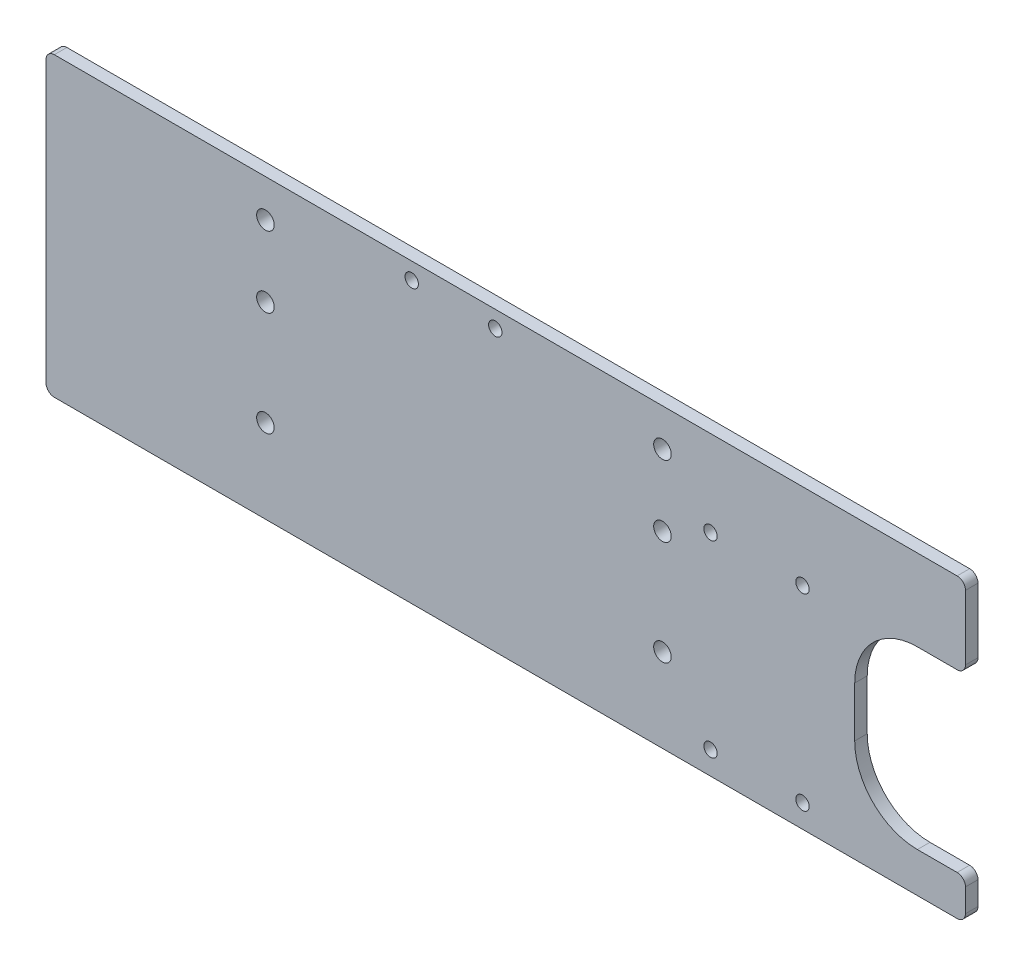
ISO-10303-21;
HEADER;
FILE_DESCRIPTION(('STEP AP214'),'2;1');
FILE_NAME('part.step','',(''),(''),'','','');
FILE_SCHEMA(('AUTOMOTIVE_DESIGN { 1 0 10303 214 1 1 1 1 }'));
ENDSEC;
DATA;
#1=APPLICATION_CONTEXT('core data for automotive mechanical design processes');
#2=APPLICATION_PROTOCOL_DEFINITION('international standard','automotive_design',2000,#1);
#3=PRODUCT_CONTEXT('',#1,'mechanical');
#4=PRODUCT('Part','Part','',(#3));
#5=PRODUCT_RELATED_PRODUCT_CATEGORY('part','',(#4));
#6=PRODUCT_DEFINITION_FORMATION('','',#4);
#7=PRODUCT_DEFINITION_CONTEXT('part definition',#1,'design');
#8=PRODUCT_DEFINITION('design','',#6,#7);
#9=PRODUCT_DEFINITION_SHAPE('','',#8);
#10=(LENGTH_UNIT() NAMED_UNIT(*) SI_UNIT(.MILLI.,.METRE.));
#11=(NAMED_UNIT(*) PLANE_ANGLE_UNIT() SI_UNIT($,.RADIAN.));
#12=(NAMED_UNIT(*) SI_UNIT($,.STERADIAN.) SOLID_ANGLE_UNIT());
#13=UNCERTAINTY_MEASURE_WITH_UNIT(LENGTH_MEASURE(1.E-05),#10,'distance_accuracy_value','');
#14=(GEOMETRIC_REPRESENTATION_CONTEXT(3) GLOBAL_UNCERTAINTY_ASSIGNED_CONTEXT((#13)) GLOBAL_UNIT_ASSIGNED_CONTEXT((#10,
#11,#12)) REPRESENTATION_CONTEXT('',''));
#15=CARTESIAN_POINT('',(0.,0.,0.));
#16=DIRECTION('',(0.,0.,1.));
#17=DIRECTION('',(1.,0.,0.));
#18=AXIS2_PLACEMENT_3D('',#15,#16,#17);
#19=CARTESIAN_POINT('',(120.,30.,-79.1580697086532));
#20=DIRECTION('',(1.,0.,0.));
#21=DIRECTION('',(0.,0.,-1.));
#22=AXIS2_PLACEMENT_3D('',#19,#20,#21);
#23=PLANE('',#22);
#24=DIRECTION('',(0.,1.,0.));
#25=VECTOR('',#24,1.);
#26=CARTESIAN_POINT('',(120.,30.,3.));
#27=LINE('',#26,#25);
#28=CARTESIAN_POINT('',(120.,-39.,3.));
#29=VERTEX_POINT('',#28);
#30=CARTESIAN_POINT('',(120.,-33.45,3.));
#31=VERTEX_POINT('',#30);
#32=EDGE_CURVE('E196',#29,#31,#27,.T.);
#33=ORIENTED_EDGE('',*,*,#32,.F.);
#34=DIRECTION('',(0.,0.,1.));
#35=VECTOR('',#34,1.);
#36=CARTESIAN_POINT('',(120.,-39.,-79.1580697086532));
#37=LINE('',#36,#35);
#38=CARTESIAN_POINT('',(120.,-39.,0.));
#39=VERTEX_POINT('',#38);
#40=EDGE_CURVE('E342',#29,#39,#37,.F.);
#41=ORIENTED_EDGE('',*,*,#40,.T.);
#42=DIRECTION('',(0.,-1.,0.));
#43=VECTOR('',#42,1.);
#44=CARTESIAN_POINT('',(120.,30.,0.));
#45=LINE('',#44,#43);
#46=CARTESIAN_POINT('',(120.,-33.45,0.));
#47=VERTEX_POINT('',#46);
#48=EDGE_CURVE('E192',#47,#39,#45,.T.);
#49=ORIENTED_EDGE('',*,*,#48,.F.);
#50=DIRECTION('',(0.,0.,-1.));
#51=VECTOR('',#50,1.);
#52=CARTESIAN_POINT('',(120.,-33.45,3.));
#53=LINE('',#52,#51);
#54=EDGE_CURVE('E340',#47,#31,#53,.F.);
#55=ORIENTED_EDGE('',*,*,#54,.T.);
#56=EDGE_LOOP('',(#33,#41,#49,#55));
#57=FACE_BOUND('',#56,.T.);
#58=ADVANCED_FACE('F36',(#57),#23,.T.);
#59=CARTESIAN_POINT('',(0.,0.,3.));
#60=DIRECTION('',(0.,0.,1.));
#61=DIRECTION('',(1.,0.,0.));
#62=AXIS2_PLACEMENT_3D('',#59,#60,#61);
#63=PLANE('',#62);
#64=CARTESIAN_POINT('',(120.,12.55,3.));
#65=VERTEX_POINT('',#64);
#66=CARTESIAN_POINT('',(120.,28.,3.));
#67=VERTEX_POINT('',#66);
#68=EDGE_CURVE('E191',#65,#67,#27,.T.);
#69=ORIENTED_EDGE('',*,*,#68,.T.);
#70=CARTESIAN_POINT('',(118.,28.,3.));
#71=DIRECTION('',(0.,0.,1.));
#72=DIRECTION('',(1.,0.,0.));
#73=AXIS2_PLACEMENT_3D('',#70,#71,#72);
#74=CIRCLE('',#73,2.);
#75=CARTESIAN_POINT('',(118.,30.,3.));
#76=VERTEX_POINT('',#75);
#77=EDGE_CURVE('E313',#67,#76,#74,.T.);
#78=ORIENTED_EDGE('',*,*,#77,.T.);
#79=DIRECTION('',(-1.,0.,0.));
#80=VECTOR('',#79,1.);
#81=CARTESIAN_POINT('',(-100.,30.,3.));
#82=LINE('',#81,#80);
#83=CARTESIAN_POINT('',(-98.,30.,3.));
#84=VERTEX_POINT('',#83);
#85=EDGE_CURVE('E209',#76,#84,#82,.T.);
#86=ORIENTED_EDGE('',*,*,#85,.T.);
#87=CARTESIAN_POINT('',(-98.,28.,3.));
#88=DIRECTION('',(0.,0.,1.));
#89=DIRECTION('',(1.,0.,0.));
#90=AXIS2_PLACEMENT_3D('',#87,#88,#89);
#91=CIRCLE('',#90,2.);
#92=CARTESIAN_POINT('',(-100.,28.,3.));
#93=VERTEX_POINT('',#92);
#94=EDGE_CURVE('E311',#84,#93,#91,.T.);
#95=ORIENTED_EDGE('',*,*,#94,.T.);
#96=DIRECTION('',(0.,-1.,0.));
#97=VECTOR('',#96,1.);
#98=CARTESIAN_POINT('',(-100.,27.,3.));
#99=LINE('',#98,#97);
#100=CARTESIAN_POINT('',(-100.,-39.,3.));
#101=VERTEX_POINT('',#100);
#102=EDGE_CURVE('E268',#93,#101,#99,.T.);
#103=ORIENTED_EDGE('',*,*,#102,.T.);
#104=CARTESIAN_POINT('',(-98.,-39.,3.));
#105=DIRECTION('',(0.,0.,1.));
#106=DIRECTION('',(1.,0.,0.));
#107=AXIS2_PLACEMENT_3D('',#104,#105,#106);
#108=CIRCLE('',#107,2.);
#109=CARTESIAN_POINT('',(-98.,-41.,3.));
#110=VERTEX_POINT('',#109);
#111=EDGE_CURVE('E309',#101,#110,#108,.T.);
#112=ORIENTED_EDGE('',*,*,#111,.T.);
#113=DIRECTION('',(1.,0.,0.));
#114=VECTOR('',#113,1.);
#115=CARTESIAN_POINT('',(-100.,-41.,3.));
#116=LINE('',#115,#114);
#117=CARTESIAN_POINT('',(118.,-41.,3.));
#118=VERTEX_POINT('',#117);
#119=EDGE_CURVE('E225',#110,#118,#116,.T.);
#120=ORIENTED_EDGE('',*,*,#119,.T.);
#121=CARTESIAN_POINT('',(118.,-39.,3.));
#122=DIRECTION('',(0.,0.,1.));
#123=DIRECTION('',(1.,0.,0.));
#124=AXIS2_PLACEMENT_3D('',#121,#122,#123);
#125=CIRCLE('',#124,2.);
#126=EDGE_CURVE('E307',#118,#29,#125,.T.);
#127=ORIENTED_EDGE('',*,*,#126,.T.);
#128=ORIENTED_EDGE('',*,*,#32,.T.);
#129=CARTESIAN_POINT('',(118.,-33.45,3.));
#130=DIRECTION('',(0.,0.,1.));
#131=DIRECTION('',(1.,0.,0.));
#132=AXIS2_PLACEMENT_3D('',#129,#130,#131);
#133=CIRCLE('',#132,2.);
#134=CARTESIAN_POINT('',(118.,-31.45,3.));
#135=VERTEX_POINT('',#134);
#136=EDGE_CURVE('E181',#31,#135,#133,.T.);
#137=ORIENTED_EDGE('',*,*,#136,.T.);
#138=DIRECTION('',(1.,0.,0.));
#139=VECTOR('',#138,1.);
#140=CARTESIAN_POINT('',(120.,-31.45,3.));
#141=LINE('',#140,#139);
#142=CARTESIAN_POINT('',(108.5,-31.45,3.));
#143=VERTEX_POINT('',#142);
#144=EDGE_CURVE('E169',#143,#135,#141,.T.);
#145=ORIENTED_EDGE('',*,*,#144,.F.);
#146=CARTESIAN_POINT('',(108.5,-16.45,3.));
#147=DIRECTION('',(0.,0.,1.));
#148=DIRECTION('',(1.,0.,0.));
#149=AXIS2_PLACEMENT_3D('',#146,#147,#148);
#150=CIRCLE('',#149,15.);
#151=CARTESIAN_POINT('',(93.5,-16.45,3.));
#152=VERTEX_POINT('',#151);
#153=EDGE_CURVE('E151',#143,#152,#150,.F.);
#154=ORIENTED_EDGE('',*,*,#153,.T.);
#155=DIRECTION('',(0.,-1.,0.));
#156=VECTOR('',#155,1.);
#157=CARTESIAN_POINT('',(93.5,10.55,3.));
#158=LINE('',#157,#156);
#159=CARTESIAN_POINT('',(93.5,-4.45,3.));
#160=VERTEX_POINT('',#159);
#161=EDGE_CURVE('E183',#160,#152,#158,.T.);
#162=ORIENTED_EDGE('',*,*,#161,.F.);
#163=CARTESIAN_POINT('',(108.5,-4.45,3.));
#164=DIRECTION('',(0.,0.,1.));
#165=DIRECTION('',(1.,0.,0.));
#166=AXIS2_PLACEMENT_3D('',#163,#164,#165);
#167=CIRCLE('',#166,15.);
#168=CARTESIAN_POINT('',(108.5,10.55,3.));
#169=VERTEX_POINT('',#168);
#170=EDGE_CURVE('E294',#160,#169,#167,.F.);
#171=ORIENTED_EDGE('',*,*,#170,.T.);
#172=DIRECTION('',(-1.,0.,0.));
#173=VECTOR('',#172,1.);
#174=CARTESIAN_POINT('',(120.,10.55,3.));
#175=LINE('',#174,#173);
#176=CARTESIAN_POINT('',(118.,10.55,3.));
#177=VERTEX_POINT('',#176);
#178=EDGE_CURVE('E186',#177,#169,#175,.T.);
#179=ORIENTED_EDGE('',*,*,#178,.F.);
#180=CARTESIAN_POINT('',(118.,12.55,3.));
#181=DIRECTION('',(0.,0.,1.));
#182=DIRECTION('',(1.,0.,0.));
#183=AXIS2_PLACEMENT_3D('',#180,#181,#182);
#184=CIRCLE('',#183,2.);
#185=EDGE_CURVE('E304',#177,#65,#184,.T.);
#186=ORIENTED_EDGE('',*,*,#185,.T.);
#187=EDGE_LOOP('',(#69,#78,#86,#95,#103,#112,#120,#127,#128,#137,#145,#154,#162,#171,#179,#186));
#188=FACE_BOUND('',#187,.T.);
#189=CARTESIAN_POINT('',(-12.5,26.,3.));
#190=DIRECTION('',(0.,0.,1.));
#191=DIRECTION('',(1.,0.,0.));
#192=AXIS2_PLACEMENT_3D('',#189,#190,#191);
#193=CIRCLE('',#192,1.6);
#194=CARTESIAN_POINT('',(-10.9,26.,3.));
#195=VERTEX_POINT('',#194);
#196=EDGE_CURVE('E198',#195,#195,#193,.T.);
#197=ORIENTED_EDGE('',*,*,#196,.F.);
#198=EDGE_LOOP('',(#197));
#199=FACE_BOUND('',#198,.T.);
#200=CARTESIAN_POINT('',(7.50000000000001,26.,3.));
#201=DIRECTION('',(0.,0.,1.));
#202=DIRECTION('',(1.,0.,0.));
#203=AXIS2_PLACEMENT_3D('',#200,#201,#202);
#204=CIRCLE('',#203,1.6);
#205=CARTESIAN_POINT('',(9.10000000000001,26.,3.));
#206=VERTEX_POINT('',#205);
#207=EDGE_CURVE('E202',#206,#206,#204,.T.);
#208=ORIENTED_EDGE('',*,*,#207,.F.);
#209=EDGE_LOOP('',(#208));
#210=FACE_BOUND('',#209,.T.);
#211=CARTESIAN_POINT('',(59.,-35.5,3.));
#212=DIRECTION('',(0.,0.,1.));
#213=DIRECTION('',(1.,0.,0.));
#214=AXIS2_PLACEMENT_3D('',#211,#212,#213);
#215=CIRCLE('',#214,1.6);
#216=CARTESIAN_POINT('',(60.6,-35.5,3.));
#217=VERTEX_POINT('',#216);
#218=EDGE_CURVE('E208',#217,#217,#215,.T.);
#219=ORIENTED_EDGE('',*,*,#218,.F.);
#220=EDGE_LOOP('',(#219));
#221=FACE_BOUND('',#220,.T.);
#222=CARTESIAN_POINT('',(81.,-35.5,3.));
#223=DIRECTION('',(0.,0.,1.));
#224=DIRECTION('',(1.,0.,0.));
#225=AXIS2_PLACEMENT_3D('',#222,#223,#224);
#226=CIRCLE('',#225,1.60000000000001);
#227=CARTESIAN_POINT('',(82.6,-35.5,3.));
#228=VERTEX_POINT('',#227);
#229=EDGE_CURVE('E217',#228,#228,#226,.T.);
#230=ORIENTED_EDGE('',*,*,#229,.F.);
#231=EDGE_LOOP('',(#230));
#232=FACE_BOUND('',#231,.T.);
#233=CARTESIAN_POINT('',(81.,9.5,3.));
#234=DIRECTION('',(0.,0.,1.));
#235=DIRECTION('',(1.,0.,0.));
#236=AXIS2_PLACEMENT_3D('',#233,#234,#235);
#237=CIRCLE('',#236,1.6);
#238=CARTESIAN_POINT('',(82.6,9.5,3.));
#239=VERTEX_POINT('',#238);
#240=EDGE_CURVE('E213',#239,#239,#237,.T.);
#241=ORIENTED_EDGE('',*,*,#240,.F.);
#242=EDGE_LOOP('',(#241));
#243=FACE_BOUND('',#242,.T.);
#244=CARTESIAN_POINT('',(59.,9.5,3.));
#245=DIRECTION('',(0.,0.,1.));
#246=DIRECTION('',(1.,0.,0.));
#247=AXIS2_PLACEMENT_3D('',#244,#245,#246);
#248=CIRCLE('',#247,1.6);
#249=CARTESIAN_POINT('',(60.6,9.5,3.));
#250=VERTEX_POINT('',#249);
#251=EDGE_CURVE('E216',#250,#250,#248,.T.);
#252=ORIENTED_EDGE('',*,*,#251,.F.);
#253=EDGE_LOOP('',(#252));
#254=FACE_BOUND('',#253,.T.);
#255=CARTESIAN_POINT('',(47.5,4.,3.));
#256=DIRECTION('',(0.,0.,1.));
#257=DIRECTION('',(-1.,0.,0.));
#258=AXIS2_PLACEMENT_3D('',#255,#256,#257);
#259=CIRCLE('',#258,2.1);
#260=CARTESIAN_POINT('',(45.4,4.,3.));
#261=VERTEX_POINT('',#260);
#262=EDGE_CURVE('E238',#261,#261,#259,.T.);
#263=ORIENTED_EDGE('',*,*,#262,.F.);
#264=EDGE_LOOP('',(#263));
#265=FACE_BOUND('',#264,.T.);
#266=CARTESIAN_POINT('',(-47.5,4.,3.));
#267=DIRECTION('',(0.,0.,1.));
#268=DIRECTION('',(1.,0.,0.));
#269=AXIS2_PLACEMENT_3D('',#266,#267,#268);
#270=CIRCLE('',#269,2.1);
#271=CARTESIAN_POINT('',(-45.4,4.,3.));
#272=VERTEX_POINT('',#271);
#273=EDGE_CURVE('E250',#272,#272,#270,.T.);
#274=ORIENTED_EDGE('',*,*,#273,.F.);
#275=EDGE_LOOP('',(#274));
#276=FACE_BOUND('',#275,.T.);
#277=CARTESIAN_POINT('',(47.5,-21.,3.));
#278=DIRECTION('',(0.,0.,1.));
#279=DIRECTION('',(-1.,0.,0.));
#280=AXIS2_PLACEMENT_3D('',#277,#278,#279);
#281=CIRCLE('',#280,2.1);
#282=CARTESIAN_POINT('',(45.4,-21.,3.));
#283=VERTEX_POINT('',#282);
#284=EDGE_CURVE('E262',#283,#283,#281,.T.);
#285=ORIENTED_EDGE('',*,*,#284,.F.);
#286=EDGE_LOOP('',(#285));
#287=FACE_BOUND('',#286,.T.);
#288=CARTESIAN_POINT('',(-47.5,21.,3.));
#289=DIRECTION('',(0.,0.,1.));
#290=DIRECTION('',(1.,0.,0.));
#291=AXIS2_PLACEMENT_3D('',#288,#289,#290);
#292=CIRCLE('',#291,2.1);
#293=CARTESIAN_POINT('',(-45.4,21.,3.));
#294=VERTEX_POINT('',#293);
#295=EDGE_CURVE('E256',#294,#294,#292,.T.);
#296=ORIENTED_EDGE('',*,*,#295,.F.);
#297=EDGE_LOOP('',(#296));
#298=FACE_BOUND('',#297,.T.);
#299=CARTESIAN_POINT('',(-47.5,-21.,3.));
#300=DIRECTION('',(0.,0.,1.));
#301=DIRECTION('',(1.,0.,0.));
#302=AXIS2_PLACEMENT_3D('',#299,#300,#301);
#303=CIRCLE('',#302,2.1);
#304=CARTESIAN_POINT('',(-45.4,-21.,3.));
#305=VERTEX_POINT('',#304);
#306=EDGE_CURVE('E244',#305,#305,#303,.T.);
#307=ORIENTED_EDGE('',*,*,#306,.F.);
#308=EDGE_LOOP('',(#307));
#309=FACE_BOUND('',#308,.T.);
#310=CARTESIAN_POINT('',(47.5,21.,3.));
#311=DIRECTION('',(0.,0.,1.));
#312=DIRECTION('',(-1.,0.,0.));
#313=AXIS2_PLACEMENT_3D('',#310,#311,#312);
#314=CIRCLE('',#313,2.1);
#315=CARTESIAN_POINT('',(45.4,21.,3.));
#316=VERTEX_POINT('',#315);
#317=EDGE_CURVE('E232',#316,#316,#314,.T.);
#318=ORIENTED_EDGE('',*,*,#317,.F.);
#319=EDGE_LOOP('',(#318));
#320=FACE_BOUND('',#319,.T.);
#321=ADVANCED_FACE('F177',(#188,#199,#210,#221,#232,#243,#254,#265,#276,#287,#298,#309,#320),
#63,.T.);
#322=CARTESIAN_POINT('',(0.,0.,0.));
#323=DIRECTION('',(0.,0.,1.));
#324=DIRECTION('',(1.,0.,0.));
#325=AXIS2_PLACEMENT_3D('',#322,#323,#324);
#326=PLANE('',#325);
#327=CARTESIAN_POINT('',(-12.5,26.,0.));
#328=DIRECTION('',(0.,0.,1.));
#329=DIRECTION('',(1.,0.,0.));
#330=AXIS2_PLACEMENT_3D('',#327,#328,#329);
#331=CIRCLE('',#330,1.6);
#332=CARTESIAN_POINT('',(-10.9,26.,0.));
#333=VERTEX_POINT('',#332);
#334=EDGE_CURVE('E212',#333,#333,#331,.T.);
#335=ORIENTED_EDGE('',*,*,#334,.T.);
#336=EDGE_LOOP('',(#335));
#337=FACE_BOUND('',#336,.T.);
#338=CARTESIAN_POINT('',(7.50000000000001,26.,0.));
#339=DIRECTION('',(0.,0.,1.));
#340=DIRECTION('',(1.,0.,0.));
#341=AXIS2_PLACEMENT_3D('',#338,#339,#340);
#342=CIRCLE('',#341,1.6);
#343=CARTESIAN_POINT('',(9.10000000000001,26.,0.));
#344=VERTEX_POINT('',#343);
#345=EDGE_CURVE('E201',#344,#344,#342,.T.);
#346=ORIENTED_EDGE('',*,*,#345,.T.);
#347=EDGE_LOOP('',(#346));
#348=FACE_BOUND('',#347,.T.);
#349=CARTESIAN_POINT('',(59.,-35.5,0.));
#350=DIRECTION('',(0.,0.,1.));
#351=DIRECTION('',(1.,0.,0.));
#352=AXIS2_PLACEMENT_3D('',#349,#350,#351);
#353=CIRCLE('',#352,1.6);
#354=CARTESIAN_POINT('',(60.6,-35.5,0.));
#355=VERTEX_POINT('',#354);
#356=EDGE_CURVE('E229',#355,#355,#353,.T.);
#357=ORIENTED_EDGE('',*,*,#356,.T.);
#358=EDGE_LOOP('',(#357));
#359=FACE_BOUND('',#358,.T.);
#360=CARTESIAN_POINT('',(81.,-35.5,0.));
#361=DIRECTION('',(0.,0.,1.));
#362=DIRECTION('',(1.,0.,0.));
#363=AXIS2_PLACEMENT_3D('',#360,#361,#362);
#364=CIRCLE('',#363,1.60000000000001);
#365=CARTESIAN_POINT('',(82.6,-35.5,0.));
#366=VERTEX_POINT('',#365);
#367=EDGE_CURVE('E277',#366,#366,#364,.T.);
#368=ORIENTED_EDGE('',*,*,#367,.T.);
#369=EDGE_LOOP('',(#368));
#370=FACE_BOUND('',#369,.T.);
#371=CARTESIAN_POINT('',(81.,9.5,0.));
#372=DIRECTION('',(0.,0.,1.));
#373=DIRECTION('',(1.,0.,0.));
#374=AXIS2_PLACEMENT_3D('',#371,#372,#373);
#375=CIRCLE('',#374,1.6);
#376=CARTESIAN_POINT('',(82.6,9.5,0.));
#377=VERTEX_POINT('',#376);
#378=EDGE_CURVE('E274',#377,#377,#375,.T.);
#379=ORIENTED_EDGE('',*,*,#378,.T.);
#380=EDGE_LOOP('',(#379));
#381=FACE_BOUND('',#380,.T.);
#382=CARTESIAN_POINT('',(59.,9.5,0.));
#383=DIRECTION('',(0.,0.,1.));
#384=DIRECTION('',(1.,0.,0.));
#385=AXIS2_PLACEMENT_3D('',#382,#383,#384);
#386=CIRCLE('',#385,1.6);
#387=CARTESIAN_POINT('',(60.6,9.5,0.));
#388=VERTEX_POINT('',#387);
#389=EDGE_CURVE('E224',#388,#388,#386,.T.);
#390=ORIENTED_EDGE('',*,*,#389,.T.);
#391=EDGE_LOOP('',(#390));
#392=FACE_BOUND('',#391,.T.);
#393=DIRECTION('',(1.,0.,0.));
#394=VECTOR('',#393,1.);
#395=CARTESIAN_POINT('',(-100.,30.,0.));
#396=LINE('',#395,#394);
#397=CARTESIAN_POINT('',(-98.,30.,0.));
#398=VERTEX_POINT('',#397);
#399=CARTESIAN_POINT('',(118.,30.,0.));
#400=VERTEX_POINT('',#399);
#401=EDGE_CURVE('E205',#398,#400,#396,.T.);
#402=ORIENTED_EDGE('',*,*,#401,.T.);
#403=CARTESIAN_POINT('',(118.,28.,0.));
#404=DIRECTION('',(0.,0.,1.));
#405=DIRECTION('',(1.,0.,0.));
#406=AXIS2_PLACEMENT_3D('',#403,#404,#405);
#407=CIRCLE('',#406,2.);
#408=CARTESIAN_POINT('',(120.,28.,0.));
#409=VERTEX_POINT('',#408);
#410=EDGE_CURVE('E329',#400,#409,#407,.F.);
#411=ORIENTED_EDGE('',*,*,#410,.T.);
#412=CARTESIAN_POINT('',(120.,12.55,0.));
#413=VERTEX_POINT('',#412);
#414=EDGE_CURVE('E195',#409,#413,#45,.T.);
#415=ORIENTED_EDGE('',*,*,#414,.T.);
#416=CARTESIAN_POINT('',(118.,12.55,0.));
#417=DIRECTION('',(0.,0.,1.));
#418=DIRECTION('',(1.,0.,0.));
#419=AXIS2_PLACEMENT_3D('',#416,#417,#418);
#420=CIRCLE('',#419,2.);
#421=CARTESIAN_POINT('',(118.,10.55,0.));
#422=VERTEX_POINT('',#421);
#423=EDGE_CURVE('E320',#413,#422,#420,.F.);
#424=ORIENTED_EDGE('',*,*,#423,.T.);
#425=DIRECTION('',(-1.,0.,0.));
#426=VECTOR('',#425,1.);
#427=CARTESIAN_POINT('',(0.,10.55,0.));
#428=LINE('',#427,#426);
#429=CARTESIAN_POINT('',(108.5,10.55,0.));
#430=VERTEX_POINT('',#429);
#431=EDGE_CURVE('E182',#422,#430,#428,.T.);
#432=ORIENTED_EDGE('',*,*,#431,.T.);
#433=CARTESIAN_POINT('',(108.5,-4.45,0.));
#434=DIRECTION('',(0.,0.,1.));
#435=DIRECTION('',(1.,0.,0.));
#436=AXIS2_PLACEMENT_3D('',#433,#434,#435);
#437=CIRCLE('',#436,15.);
#438=CARTESIAN_POINT('',(93.5,-4.45,0.));
#439=VERTEX_POINT('',#438);
#440=EDGE_CURVE('E297',#430,#439,#437,.T.);
#441=ORIENTED_EDGE('',*,*,#440,.T.);
#442=DIRECTION('',(0.,-1.,0.));
#443=VECTOR('',#442,1.);
#444=CARTESIAN_POINT('',(93.5,0.,0.));
#445=LINE('',#444,#443);
#446=CARTESIAN_POINT('',(93.5,-16.45,0.));
#447=VERTEX_POINT('',#446);
#448=EDGE_CURVE('E174',#439,#447,#445,.T.);
#449=ORIENTED_EDGE('',*,*,#448,.T.);
#450=CARTESIAN_POINT('',(108.5,-16.45,0.));
#451=DIRECTION('',(0.,0.,1.));
#452=DIRECTION('',(1.,0.,0.));
#453=AXIS2_PLACEMENT_3D('',#450,#451,#452);
#454=CIRCLE('',#453,15.);
#455=CARTESIAN_POINT('',(108.5,-31.45,0.));
#456=VERTEX_POINT('',#455);
#457=EDGE_CURVE('E161',#447,#456,#454,.T.);
#458=ORIENTED_EDGE('',*,*,#457,.T.);
#459=DIRECTION('',(1.,0.,0.));
#460=VECTOR('',#459,1.);
#461=CARTESIAN_POINT('',(0.,-31.45,0.));
#462=LINE('',#461,#460);
#463=CARTESIAN_POINT('',(118.,-31.45,0.));
#464=VERTEX_POINT('',#463);
#465=EDGE_CURVE('E172',#456,#464,#462,.T.);
#466=ORIENTED_EDGE('',*,*,#465,.T.);
#467=CARTESIAN_POINT('',(118.,-33.45,0.));
#468=DIRECTION('',(0.,0.,1.));
#469=DIRECTION('',(1.,0.,0.));
#470=AXIS2_PLACEMENT_3D('',#467,#468,#469);
#471=CIRCLE('',#470,2.);
#472=EDGE_CURVE('E322',#464,#47,#471,.F.);
#473=ORIENTED_EDGE('',*,*,#472,.T.);
#474=ORIENTED_EDGE('',*,*,#48,.T.);
#475=CARTESIAN_POINT('',(118.,-39.,0.));
#476=DIRECTION('',(0.,0.,1.));
#477=DIRECTION('',(1.,0.,0.));
#478=AXIS2_PLACEMENT_3D('',#475,#476,#477);
#479=CIRCLE('',#478,2.);
#480=CARTESIAN_POINT('',(118.,-41.,0.));
#481=VERTEX_POINT('',#480);
#482=EDGE_CURVE('E324',#39,#481,#479,.F.);
#483=ORIENTED_EDGE('',*,*,#482,.T.);
#484=DIRECTION('',(-1.,0.,0.));
#485=VECTOR('',#484,1.);
#486=CARTESIAN_POINT('',(-100.,-41.,0.));
#487=LINE('',#486,#485);
#488=CARTESIAN_POINT('',(-98.,-41.,0.));
#489=VERTEX_POINT('',#488);
#490=EDGE_CURVE('E228',#481,#489,#487,.T.);
#491=ORIENTED_EDGE('',*,*,#490,.T.);
#492=CARTESIAN_POINT('',(-98.,-39.,0.));
#493=DIRECTION('',(0.,0.,1.));
#494=DIRECTION('',(1.,0.,0.));
#495=AXIS2_PLACEMENT_3D('',#492,#493,#494);
#496=CIRCLE('',#495,2.);
#497=CARTESIAN_POINT('',(-100.,-39.,0.));
#498=VERTEX_POINT('',#497);
#499=EDGE_CURVE('E51',#489,#498,#496,.F.);
#500=ORIENTED_EDGE('',*,*,#499,.T.);
#501=DIRECTION('',(0.,-1.,0.));
#502=VECTOR('',#501,1.);
#503=CARTESIAN_POINT('',(-100.,27.,0.));
#504=LINE('',#503,#502);
#505=CARTESIAN_POINT('',(-100.,28.,0.));
#506=VERTEX_POINT('',#505);
#507=EDGE_CURVE('E265',#506,#498,#504,.T.);
#508=ORIENTED_EDGE('',*,*,#507,.F.);
#509=CARTESIAN_POINT('',(-98.,28.,0.));
#510=DIRECTION('',(0.,0.,1.));
#511=DIRECTION('',(1.,0.,0.));
#512=AXIS2_PLACEMENT_3D('',#509,#510,#511);
#513=CIRCLE('',#512,2.);
#514=EDGE_CURVE('E327',#506,#398,#513,.F.);
#515=ORIENTED_EDGE('',*,*,#514,.T.);
#516=EDGE_LOOP('',(#402,#411,#415,#424,#432,#441,#449,#458,#466,#473,#474,#483,#491,#500,#508,#515));
#517=FACE_BOUND('',#516,.T.);
#518=CARTESIAN_POINT('',(47.5,-21.,0.));
#519=DIRECTION('',(0.,0.,1.));
#520=DIRECTION('',(-1.,0.,0.));
#521=AXIS2_PLACEMENT_3D('',#518,#519,#520);
#522=CIRCLE('',#521,2.1);
#523=CARTESIAN_POINT('',(45.4,-21.,0.));
#524=VERTEX_POINT('',#523);
#525=EDGE_CURVE('E259',#524,#524,#522,.T.);
#526=ORIENTED_EDGE('',*,*,#525,.T.);
#527=EDGE_LOOP('',(#526));
#528=FACE_BOUND('',#527,.T.);
#529=CARTESIAN_POINT('',(-47.5,21.,0.));
#530=DIRECTION('',(0.,0.,1.));
#531=DIRECTION('',(1.,0.,0.));
#532=AXIS2_PLACEMENT_3D('',#529,#530,#531);
#533=CIRCLE('',#532,2.1);
#534=CARTESIAN_POINT('',(-45.4,21.,0.));
#535=VERTEX_POINT('',#534);
#536=EDGE_CURVE('E253',#535,#535,#533,.T.);
#537=ORIENTED_EDGE('',*,*,#536,.T.);
#538=EDGE_LOOP('',(#537));
#539=FACE_BOUND('',#538,.T.);
#540=CARTESIAN_POINT('',(-47.5,4.,0.));
#541=DIRECTION('',(0.,0.,1.));
#542=DIRECTION('',(1.,0.,0.));
#543=AXIS2_PLACEMENT_3D('',#540,#541,#542);
#544=CIRCLE('',#543,2.1);
#545=CARTESIAN_POINT('',(-45.4,4.,0.));
#546=VERTEX_POINT('',#545);
#547=EDGE_CURVE('E247',#546,#546,#544,.T.);
#548=ORIENTED_EDGE('',*,*,#547,.T.);
#549=EDGE_LOOP('',(#548));
#550=FACE_BOUND('',#549,.T.);
#551=CARTESIAN_POINT('',(-47.5,-21.,0.));
#552=DIRECTION('',(0.,0.,1.));
#553=DIRECTION('',(1.,0.,0.));
#554=AXIS2_PLACEMENT_3D('',#551,#552,#553);
#555=CIRCLE('',#554,2.1);
#556=CARTESIAN_POINT('',(-45.4,-21.,0.));
#557=VERTEX_POINT('',#556);
#558=EDGE_CURVE('E241',#557,#557,#555,.T.);
#559=ORIENTED_EDGE('',*,*,#558,.T.);
#560=EDGE_LOOP('',(#559));
#561=FACE_BOUND('',#560,.T.);
#562=CARTESIAN_POINT('',(47.5,4.,0.));
#563=DIRECTION('',(0.,0.,1.));
#564=DIRECTION('',(-1.,0.,0.));
#565=AXIS2_PLACEMENT_3D('',#562,#563,#564);
#566=CIRCLE('',#565,2.1);
#567=CARTESIAN_POINT('',(45.4,4.,0.));
#568=VERTEX_POINT('',#567);
#569=EDGE_CURVE('E235',#568,#568,#566,.T.);
#570=ORIENTED_EDGE('',*,*,#569,.T.);
#571=EDGE_LOOP('',(#570));
#572=FACE_BOUND('',#571,.T.);
#573=CARTESIAN_POINT('',(47.5,21.,0.));
#574=DIRECTION('',(0.,0.,1.));
#575=DIRECTION('',(-1.,0.,0.));
#576=AXIS2_PLACEMENT_3D('',#573,#574,#575);
#577=CIRCLE('',#576,2.1);
#578=CARTESIAN_POINT('',(45.4,21.,0.));
#579=VERTEX_POINT('',#578);
#580=EDGE_CURVE('E231',#579,#579,#577,.T.);
#581=ORIENTED_EDGE('',*,*,#580,.T.);
#582=EDGE_LOOP('',(#581));
#583=FACE_BOUND('',#582,.T.);
#584=ADVANCED_FACE('F344',(#337,#348,#359,#370,#381,#392,#517,#528,#539,#550,#561,#572,#583),
#326,.F.);
#585=CARTESIAN_POINT('',(-100.,27.,3.));
#586=DIRECTION('',(1.,0.,0.));
#587=DIRECTION('',(0.,0.,-1.));
#588=AXIS2_PLACEMENT_3D('',#585,#586,#587);
#589=PLANE('',#588);
#590=ORIENTED_EDGE('',*,*,#102,.F.);
#591=DIRECTION('',(0.,0.,1.));
#592=VECTOR('',#591,1.);
#593=CARTESIAN_POINT('',(-100.,28.,0.));
#594=LINE('',#593,#592);
#595=EDGE_CURVE('E58',#93,#506,#594,.F.);
#596=ORIENTED_EDGE('',*,*,#595,.T.);
#597=ORIENTED_EDGE('',*,*,#507,.T.);
#598=DIRECTION('',(0.,0.,1.));
#599=VECTOR('',#598,1.);
#600=CARTESIAN_POINT('',(-100.,-39.,3.));
#601=LINE('',#600,#599);
#602=EDGE_CURVE('E331',#498,#101,#601,.T.);
#603=ORIENTED_EDGE('',*,*,#602,.T.);
#604=EDGE_LOOP('',(#590,#596,#597,#603));
#605=FACE_BOUND('',#604,.T.);
#606=ADVANCED_FACE('F381',(#605),#589,.F.);
#607=CARTESIAN_POINT('',(47.5,-21.,3.));
#608=DIRECTION('',(0.,0.,-1.));
#609=DIRECTION('',(-1.,0.,0.));
#610=AXIS2_PLACEMENT_3D('',#607,#608,#609);
#611=CYLINDRICAL_SURFACE('',#610,2.1);
#612=ORIENTED_EDGE('',*,*,#284,.T.);
#613=EDGE_LOOP('',(#612));
#614=FACE_BOUND('',#613,.T.);
#615=ORIENTED_EDGE('',*,*,#525,.F.);
#616=EDGE_LOOP('',(#615));
#617=FACE_BOUND('',#616,.T.);
#618=ADVANCED_FACE('F468',(#614,#617),#611,.F.);
#619=CARTESIAN_POINT('',(-47.5,21.,3.));
#620=DIRECTION('',(0.,0.,-1.));
#621=DIRECTION('',(-1.,0.,0.));
#622=AXIS2_PLACEMENT_3D('',#619,#620,#621);
#623=CYLINDRICAL_SURFACE('',#622,2.1);
#624=ORIENTED_EDGE('',*,*,#295,.T.);
#625=EDGE_LOOP('',(#624));
#626=FACE_BOUND('',#625,.T.);
#627=ORIENTED_EDGE('',*,*,#536,.F.);
#628=EDGE_LOOP('',(#627));
#629=FACE_BOUND('',#628,.T.);
#630=ADVANCED_FACE('F464',(#626,#629),#623,.F.);
#631=CARTESIAN_POINT('',(-47.5,4.,3.));
#632=DIRECTION('',(0.,0.,-1.));
#633=DIRECTION('',(-1.,0.,0.));
#634=AXIS2_PLACEMENT_3D('',#631,#632,#633);
#635=CYLINDRICAL_SURFACE('',#634,2.1);
#636=ORIENTED_EDGE('',*,*,#273,.T.);
#637=EDGE_LOOP('',(#636));
#638=FACE_BOUND('',#637,.T.);
#639=ORIENTED_EDGE('',*,*,#547,.F.);
#640=EDGE_LOOP('',(#639));
#641=FACE_BOUND('',#640,.T.);
#642=ADVANCED_FACE('F460',(#638,#641),#635,.F.);
#643=CARTESIAN_POINT('',(-47.5,-21.,3.));
#644=DIRECTION('',(0.,0.,-1.));
#645=DIRECTION('',(-1.,0.,0.));
#646=AXIS2_PLACEMENT_3D('',#643,#644,#645);
#647=CYLINDRICAL_SURFACE('',#646,2.1);
#648=ORIENTED_EDGE('',*,*,#306,.T.);
#649=EDGE_LOOP('',(#648));
#650=FACE_BOUND('',#649,.T.);
#651=ORIENTED_EDGE('',*,*,#558,.F.);
#652=EDGE_LOOP('',(#651));
#653=FACE_BOUND('',#652,.T.);
#654=ADVANCED_FACE('F456',(#650,#653),#647,.F.);
#655=CARTESIAN_POINT('',(47.5,4.,3.));
#656=DIRECTION('',(0.,0.,-1.));
#657=DIRECTION('',(-1.,0.,0.));
#658=AXIS2_PLACEMENT_3D('',#655,#656,#657);
#659=CYLINDRICAL_SURFACE('',#658,2.1);
#660=ORIENTED_EDGE('',*,*,#262,.T.);
#661=EDGE_LOOP('',(#660));
#662=FACE_BOUND('',#661,.T.);
#663=ORIENTED_EDGE('',*,*,#569,.F.);
#664=EDGE_LOOP('',(#663));
#665=FACE_BOUND('',#664,.T.);
#666=ADVANCED_FACE('F452',(#662,#665),#659,.F.);
#667=CARTESIAN_POINT('',(47.5,21.,3.));
#668=DIRECTION('',(0.,0.,-1.));
#669=DIRECTION('',(-1.,0.,0.));
#670=AXIS2_PLACEMENT_3D('',#667,#668,#669);
#671=CYLINDRICAL_SURFACE('',#670,2.1);
#672=ORIENTED_EDGE('',*,*,#317,.T.);
#673=EDGE_LOOP('',(#672));
#674=FACE_BOUND('',#673,.T.);
#675=ORIENTED_EDGE('',*,*,#580,.F.);
#676=EDGE_LOOP('',(#675));
#677=FACE_BOUND('',#676,.T.);
#678=ADVANCED_FACE('F449',(#674,#677),#671,.F.);
#679=CARTESIAN_POINT('',(-100.,-41.,-200.489401216124));
#680=DIRECTION('',(0.,-1.,0.));
#681=DIRECTION('',(0.,0.,-1.));
#682=AXIS2_PLACEMENT_3D('',#679,#680,#681);
#683=PLANE('',#682);
#684=ORIENTED_EDGE('',*,*,#119,.F.);
#685=DIRECTION('',(0.,0.,1.));
#686=VECTOR('',#685,1.);
#687=CARTESIAN_POINT('',(-98.,-41.,0.));
#688=LINE('',#687,#686);
#689=EDGE_CURVE('E338',#110,#489,#688,.F.);
#690=ORIENTED_EDGE('',*,*,#689,.T.);
#691=ORIENTED_EDGE('',*,*,#490,.F.);
#692=DIRECTION('',(0.,0.,1.));
#693=VECTOR('',#692,1.);
#694=CARTESIAN_POINT('',(118.,-41.,-200.489401216124));
#695=LINE('',#694,#693);
#696=EDGE_CURVE('E335',#481,#118,#695,.T.);
#697=ORIENTED_EDGE('',*,*,#696,.T.);
#698=EDGE_LOOP('',(#684,#690,#691,#697));
#699=FACE_BOUND('',#698,.T.);
#700=ADVANCED_FACE('F388',(#699),#683,.T.);
#701=CARTESIAN_POINT('',(59.,9.5,-7.));
#702=DIRECTION('',(0.,0.,1.));
#703=DIRECTION('',(1.,0.,0.));
#704=AXIS2_PLACEMENT_3D('',#701,#702,#703);
#705=CYLINDRICAL_SURFACE('',#704,1.6);
#706=ORIENTED_EDGE('',*,*,#251,.T.);
#707=EDGE_LOOP('',(#706));
#708=FACE_BOUND('',#707,.T.);
#709=ORIENTED_EDGE('',*,*,#389,.F.);
#710=EDGE_LOOP('',(#709));
#711=FACE_BOUND('',#710,.T.);
#712=ADVANCED_FACE('F436',(#708,#711),#705,.F.);
#713=CARTESIAN_POINT('',(81.,9.5,-7.));
#714=DIRECTION('',(0.,0.,1.));
#715=DIRECTION('',(1.,0.,0.));
#716=AXIS2_PLACEMENT_3D('',#713,#714,#715);
#717=CYLINDRICAL_SURFACE('',#716,1.6);
#718=ORIENTED_EDGE('',*,*,#240,.T.);
#719=EDGE_LOOP('',(#718));
#720=FACE_BOUND('',#719,.T.);
#721=ORIENTED_EDGE('',*,*,#378,.F.);
#722=EDGE_LOOP('',(#721));
#723=FACE_BOUND('',#722,.T.);
#724=ADVANCED_FACE('F432',(#720,#723),#717,.F.);
#725=CARTESIAN_POINT('',(81.,-35.5,-7.));
#726=DIRECTION('',(0.,0.,1.));
#727=DIRECTION('',(1.,0.,0.));
#728=AXIS2_PLACEMENT_3D('',#725,#726,#727);
#729=CYLINDRICAL_SURFACE('',#728,1.60000000000001);
#730=ORIENTED_EDGE('',*,*,#229,.T.);
#731=EDGE_LOOP('',(#730));
#732=FACE_BOUND('',#731,.T.);
#733=ORIENTED_EDGE('',*,*,#367,.F.);
#734=EDGE_LOOP('',(#733));
#735=FACE_BOUND('',#734,.T.);
#736=ADVANCED_FACE('F435',(#732,#735),#729,.F.);
#737=CARTESIAN_POINT('',(59.,-35.5,-7.));
#738=DIRECTION('',(0.,0.,1.));
#739=DIRECTION('',(1.,0.,0.));
#740=AXIS2_PLACEMENT_3D('',#737,#738,#739);
#741=CYLINDRICAL_SURFACE('',#740,1.6);
#742=ORIENTED_EDGE('',*,*,#218,.T.);
#743=EDGE_LOOP('',(#742));
#744=FACE_BOUND('',#743,.T.);
#745=ORIENTED_EDGE('',*,*,#356,.F.);
#746=EDGE_LOOP('',(#745));
#747=FACE_BOUND('',#746,.T.);
#748=ADVANCED_FACE('F431',(#744,#747),#741,.F.);
#749=CARTESIAN_POINT('',(-100.,30.,-185.024322725419));
#750=DIRECTION('',(0.,1.,0.));
#751=DIRECTION('',(0.,0.,1.));
#752=AXIS2_PLACEMENT_3D('',#749,#750,#751);
#753=PLANE('',#752);
#754=ORIENTED_EDGE('',*,*,#85,.F.);
#755=DIRECTION('',(0.,0.,1.));
#756=VECTOR('',#755,1.);
#757=CARTESIAN_POINT('',(118.,30.,-185.024322725419));
#758=LINE('',#757,#756);
#759=EDGE_CURVE('E318',#76,#400,#758,.F.);
#760=ORIENTED_EDGE('',*,*,#759,.T.);
#761=ORIENTED_EDGE('',*,*,#401,.F.);
#762=DIRECTION('',(0.,0.,1.));
#763=VECTOR('',#762,1.);
#764=CARTESIAN_POINT('',(-98.,30.,3.));
#765=LINE('',#764,#763);
#766=EDGE_CURVE('E315',#398,#84,#765,.T.);
#767=ORIENTED_EDGE('',*,*,#766,.T.);
#768=EDGE_LOOP('',(#754,#760,#761,#767));
#769=FACE_BOUND('',#768,.T.);
#770=ADVANCED_FACE('F376',(#769),#753,.T.);
#771=CARTESIAN_POINT('',(7.50000000000001,26.,-7.));
#772=DIRECTION('',(0.,0.,1.));
#773=DIRECTION('',(1.,0.,0.));
#774=AXIS2_PLACEMENT_3D('',#771,#772,#773);
#775=CYLINDRICAL_SURFACE('',#774,1.6);
#776=ORIENTED_EDGE('',*,*,#207,.T.);
#777=EDGE_LOOP('',(#776));
#778=FACE_BOUND('',#777,.T.);
#779=ORIENTED_EDGE('',*,*,#345,.F.);
#780=EDGE_LOOP('',(#779));
#781=FACE_BOUND('',#780,.T.);
#782=ADVANCED_FACE('F420',(#778,#781),#775,.F.);
#783=CARTESIAN_POINT('',(-12.5,26.,-7.));
#784=DIRECTION('',(0.,0.,1.));
#785=DIRECTION('',(1.,0.,0.));
#786=AXIS2_PLACEMENT_3D('',#783,#784,#785);
#787=CYLINDRICAL_SURFACE('',#786,1.6);
#788=ORIENTED_EDGE('',*,*,#196,.T.);
#789=EDGE_LOOP('',(#788));
#790=FACE_BOUND('',#789,.T.);
#791=ORIENTED_EDGE('',*,*,#334,.F.);
#792=EDGE_LOOP('',(#791));
#793=FACE_BOUND('',#792,.T.);
#794=ADVANCED_FACE('F414',(#790,#793),#787,.F.);
#795=ORIENTED_EDGE('',*,*,#414,.F.);
#796=DIRECTION('',(0.,0.,1.));
#797=VECTOR('',#796,1.);
#798=CARTESIAN_POINT('',(120.,28.,-79.1580697086532));
#799=LINE('',#798,#797);
#800=EDGE_CURVE('E301',#409,#67,#799,.T.);
#801=ORIENTED_EDGE('',*,*,#800,.T.);
#802=ORIENTED_EDGE('',*,*,#68,.F.);
#803=DIRECTION('',(0.,0.,1.));
#804=VECTOR('',#803,1.);
#805=CARTESIAN_POINT('',(120.,12.55,0.));
#806=LINE('',#805,#804);
#807=EDGE_CURVE('E299',#65,#413,#806,.F.);
#808=ORIENTED_EDGE('',*,*,#807,.T.);
#809=EDGE_LOOP('',(#795,#801,#802,#808));
#810=FACE_BOUND('',#809,.T.);
#811=ADVANCED_FACE('F367',(#810),#23,.T.);
#812=CARTESIAN_POINT('',(93.5,10.55,-7.));
#813=DIRECTION('',(-1.,0.,0.));
#814=DIRECTION('',(0.,0.,1.));
#815=AXIS2_PLACEMENT_3D('',#812,#813,#814);
#816=PLANE('',#815);
#817=ORIENTED_EDGE('',*,*,#161,.T.);
#818=DIRECTION('',(0.,0.,1.));
#819=VECTOR('',#818,1.);
#820=CARTESIAN_POINT('',(93.5,-16.45,0.));
#821=LINE('',#820,#819);
#822=EDGE_CURVE('E156',#152,#447,#821,.F.);
#823=ORIENTED_EDGE('',*,*,#822,.T.);
#824=ORIENTED_EDGE('',*,*,#448,.F.);
#825=DIRECTION('',(0.,0.,1.));
#826=VECTOR('',#825,1.);
#827=CARTESIAN_POINT('',(93.5,-4.45,3.));
#828=LINE('',#827,#826);
#829=EDGE_CURVE('E173',#439,#160,#828,.T.);
#830=ORIENTED_EDGE('',*,*,#829,.T.);
#831=EDGE_LOOP('',(#817,#823,#824,#830));
#832=FACE_BOUND('',#831,.T.);
#833=ADVANCED_FACE('F351',(#832),#816,.F.);
#834=CARTESIAN_POINT('',(120.,-31.45,-7.));
#835=DIRECTION('',(0.,-1.,0.));
#836=DIRECTION('',(0.,0.,-1.));
#837=AXIS2_PLACEMENT_3D('',#834,#835,#836);
#838=PLANE('',#837);
#839=ORIENTED_EDGE('',*,*,#144,.T.);
#840=DIRECTION('',(0.,0.,-1.));
#841=VECTOR('',#840,1.);
#842=CARTESIAN_POINT('',(118.,-31.45,0.));
#843=LINE('',#842,#841);
#844=EDGE_CURVE('E44',#135,#464,#843,.T.);
#845=ORIENTED_EDGE('',*,*,#844,.T.);
#846=ORIENTED_EDGE('',*,*,#465,.F.);
#847=DIRECTION('',(0.,0.,1.));
#848=VECTOR('',#847,1.);
#849=CARTESIAN_POINT('',(108.5,-31.45,3.));
#850=LINE('',#849,#848);
#851=EDGE_CURVE('E155',#456,#143,#850,.T.);
#852=ORIENTED_EDGE('',*,*,#851,.T.);
#853=EDGE_LOOP('',(#839,#845,#846,#852));
#854=FACE_BOUND('',#853,.T.);
#855=ADVANCED_FACE('F167',(#854),#838,.F.);
#856=CARTESIAN_POINT('',(120.,10.55,-7.));
#857=DIRECTION('',(0.,1.,0.));
#858=DIRECTION('',(-1.,0.,0.));
#859=AXIS2_PLACEMENT_3D('',#856,#857,#858);
#860=PLANE('',#859);
#861=ORIENTED_EDGE('',*,*,#431,.F.);
#862=DIRECTION('',(0.,0.,1.));
#863=VECTOR('',#862,1.);
#864=CARTESIAN_POINT('',(118.,10.55,3.));
#865=LINE('',#864,#863);
#866=EDGE_CURVE('E11',#422,#177,#865,.T.);
#867=ORIENTED_EDGE('',*,*,#866,.T.);
#868=ORIENTED_EDGE('',*,*,#178,.T.);
#869=DIRECTION('',(0.,0.,1.));
#870=VECTOR('',#869,1.);
#871=CARTESIAN_POINT('',(108.5,10.55,0.));
#872=LINE('',#871,#870);
#873=EDGE_CURVE('E162',#169,#430,#872,.F.);
#874=ORIENTED_EDGE('',*,*,#873,.T.);
#875=EDGE_LOOP('',(#861,#867,#868,#874));
#876=FACE_BOUND('',#875,.T.);
#877=ADVANCED_FACE('F359',(#876),#860,.F.);
#878=CARTESIAN_POINT('',(108.5,-16.45,-7.));
#879=DIRECTION('',(0.,0.,-1.));
#880=DIRECTION('',(-1.,0.,0.));
#881=AXIS2_PLACEMENT_3D('',#878,#879,#880);
#882=CYLINDRICAL_SURFACE('',#881,15.);
#883=ORIENTED_EDGE('',*,*,#457,.F.);
#884=ORIENTED_EDGE('',*,*,#822,.F.);
#885=ORIENTED_EDGE('',*,*,#153,.F.);
#886=ORIENTED_EDGE('',*,*,#851,.F.);
#887=EDGE_LOOP('',(#883,#884,#885,#886));
#888=FACE_BOUND('',#887,.T.);
#889=ADVANCED_FACE('F154',(#888),#882,.F.);
#890=CARTESIAN_POINT('',(108.5,-4.45,-7.));
#891=DIRECTION('',(0.,0.,-1.));
#892=DIRECTION('',(-1.,0.,0.));
#893=AXIS2_PLACEMENT_3D('',#890,#891,#892);
#894=CYLINDRICAL_SURFACE('',#893,15.);
#895=ORIENTED_EDGE('',*,*,#440,.F.);
#896=ORIENTED_EDGE('',*,*,#873,.F.);
#897=ORIENTED_EDGE('',*,*,#170,.F.);
#898=ORIENTED_EDGE('',*,*,#829,.F.);
#899=EDGE_LOOP('',(#895,#896,#897,#898));
#900=FACE_BOUND('',#899,.T.);
#901=ADVANCED_FACE('F353',(#900),#894,.F.);
#902=CARTESIAN_POINT('',(118.,28.,-79.1580697086532));
#903=DIRECTION('',(0.,0.,1.));
#904=DIRECTION('',(1.,0.,0.));
#905=AXIS2_PLACEMENT_3D('',#902,#903,#904);
#906=CYLINDRICAL_SURFACE('',#905,2.);
#907=ORIENTED_EDGE('',*,*,#410,.F.);
#908=ORIENTED_EDGE('',*,*,#759,.F.);
#909=ORIENTED_EDGE('',*,*,#77,.F.);
#910=ORIENTED_EDGE('',*,*,#800,.F.);
#911=EDGE_LOOP('',(#907,#908,#909,#910));
#912=FACE_BOUND('',#911,.T.);
#913=ADVANCED_FACE('F373',(#912),#906,.T.);
#914=CARTESIAN_POINT('',(-98.,28.,-185.024322725419));
#915=DIRECTION('',(0.,0.,-1.));
#916=DIRECTION('',(-1.,0.,0.));
#917=AXIS2_PLACEMENT_3D('',#914,#915,#916);
#918=CYLINDRICAL_SURFACE('',#917,2.);
#919=ORIENTED_EDGE('',*,*,#514,.F.);
#920=ORIENTED_EDGE('',*,*,#595,.F.);
#921=ORIENTED_EDGE('',*,*,#94,.F.);
#922=ORIENTED_EDGE('',*,*,#766,.F.);
#923=EDGE_LOOP('',(#919,#920,#921,#922));
#924=FACE_BOUND('',#923,.T.);
#925=ADVANCED_FACE('F380',(#924),#918,.T.);
#926=CARTESIAN_POINT('',(-98.,-39.,3.));
#927=DIRECTION('',(0.,0.,-1.));
#928=DIRECTION('',(-1.,0.,0.));
#929=AXIS2_PLACEMENT_3D('',#926,#927,#928);
#930=CYLINDRICAL_SURFACE('',#929,2.);
#931=ORIENTED_EDGE('',*,*,#499,.F.);
#932=ORIENTED_EDGE('',*,*,#689,.F.);
#933=ORIENTED_EDGE('',*,*,#111,.F.);
#934=ORIENTED_EDGE('',*,*,#602,.F.);
#935=EDGE_LOOP('',(#931,#932,#933,#934));
#936=FACE_BOUND('',#935,.T.);
#937=ADVANCED_FACE('F384',(#936),#930,.T.);
#938=CARTESIAN_POINT('',(118.,-39.,-200.489401216124));
#939=DIRECTION('',(0.,0.,1.));
#940=DIRECTION('',(1.,0.,0.));
#941=AXIS2_PLACEMENT_3D('',#938,#939,#940);
#942=CYLINDRICAL_SURFACE('',#941,2.);
#943=ORIENTED_EDGE('',*,*,#482,.F.);
#944=ORIENTED_EDGE('',*,*,#40,.F.);
#945=ORIENTED_EDGE('',*,*,#126,.F.);
#946=ORIENTED_EDGE('',*,*,#696,.F.);
#947=EDGE_LOOP('',(#943,#944,#945,#946));
#948=FACE_BOUND('',#947,.T.);
#949=ADVANCED_FACE('F393',(#948),#942,.T.);
#950=CARTESIAN_POINT('',(118.,-33.45,-7.));
#951=DIRECTION('',(0.,0.,1.));
#952=DIRECTION('',(1.,0.,0.));
#953=AXIS2_PLACEMENT_3D('',#950,#951,#952);
#954=CYLINDRICAL_SURFACE('',#953,2.);
#955=ORIENTED_EDGE('',*,*,#136,.F.);
#956=ORIENTED_EDGE('',*,*,#54,.F.);
#957=ORIENTED_EDGE('',*,*,#472,.F.);
#958=ORIENTED_EDGE('',*,*,#844,.F.);
#959=EDGE_LOOP('',(#955,#956,#957,#958));
#960=FACE_BOUND('',#959,.T.);
#961=ADVANCED_FACE('F398',(#960),#954,.T.);
#962=CARTESIAN_POINT('',(118.,12.55,-7.));
#963=DIRECTION('',(0.,0.,-1.));
#964=DIRECTION('',(-1.,0.,0.));
#965=AXIS2_PLACEMENT_3D('',#962,#963,#964);
#966=CYLINDRICAL_SURFACE('',#965,2.);
#967=ORIENTED_EDGE('',*,*,#423,.F.);
#968=ORIENTED_EDGE('',*,*,#807,.F.);
#969=ORIENTED_EDGE('',*,*,#185,.F.);
#970=ORIENTED_EDGE('',*,*,#866,.F.);
#971=EDGE_LOOP('',(#967,#968,#969,#970));
#972=FACE_BOUND('',#971,.T.);
#973=ADVANCED_FACE('F38',(#972),#966,.T.);
#974=CLOSED_SHELL('',(#58,#321,#584,#606,#618,#630,#642,#654,#666,#678,#700,#712,#724,#736,#748,
#770,#782,#794,#811,#833,#855,#877,#889,#901,#913,#925,#937,#949,#961,#973));
#975=MANIFOLD_SOLID_BREP('B2',#974);
#976=ADVANCED_BREP_SHAPE_REPRESENTATION('',(#18,#975),#14);
#977=SHAPE_DEFINITION_REPRESENTATION(#9,#976);
ENDSEC;
END-ISO-10303-21;
